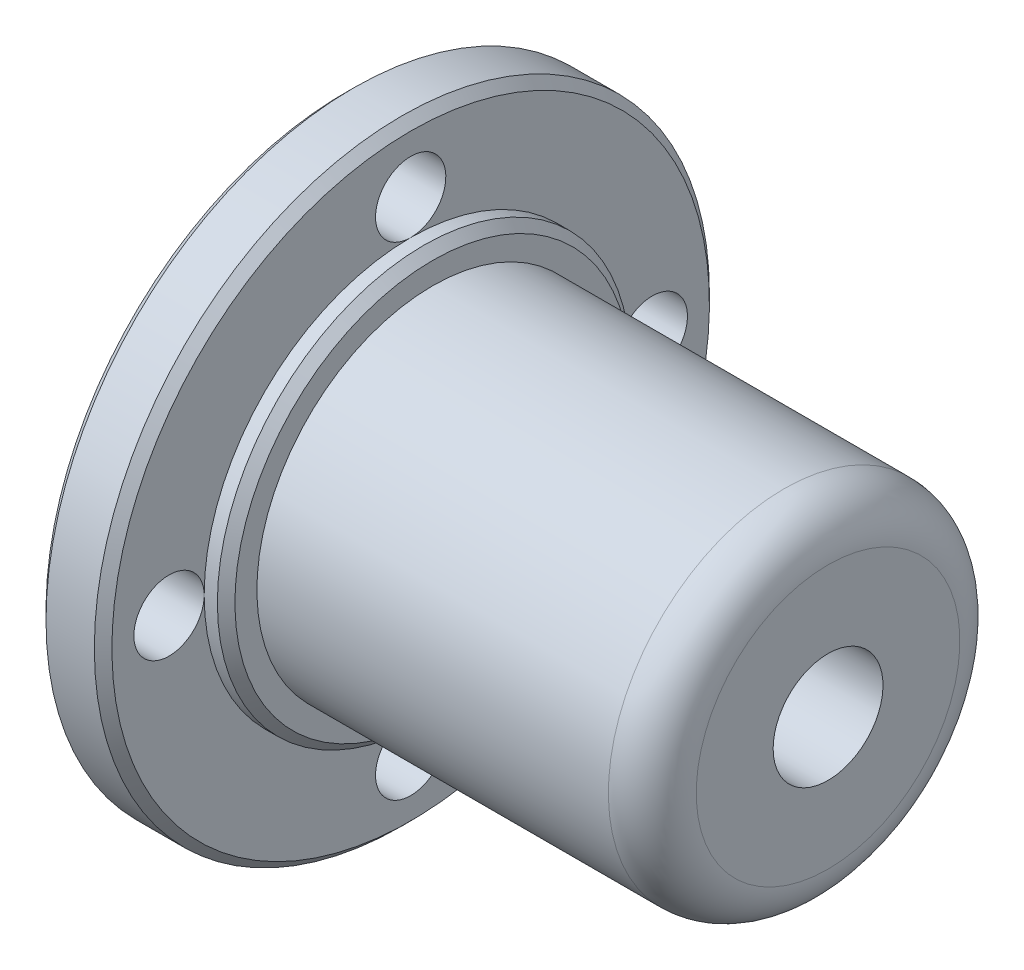
ISO-10303-21;
HEADER;
FILE_DESCRIPTION(('STEP AP214'),'2;1');
FILE_NAME('part.step','',(''),(''),'','','');
FILE_SCHEMA(('AUTOMOTIVE_DESIGN { 1 0 10303 214 1 1 1 1 }'));
ENDSEC;
DATA;
#1=APPLICATION_CONTEXT('core data for automotive mechanical design processes');
#2=APPLICATION_PROTOCOL_DEFINITION('international standard','automotive_design',2000,#1);
#3=PRODUCT_CONTEXT('',#1,'mechanical');
#4=PRODUCT('Part','Part','',(#3));
#5=PRODUCT_RELATED_PRODUCT_CATEGORY('part','',(#4));
#6=PRODUCT_DEFINITION_FORMATION('','',#4);
#7=PRODUCT_DEFINITION_CONTEXT('part definition',#1,'design');
#8=PRODUCT_DEFINITION('design','',#6,#7);
#9=PRODUCT_DEFINITION_SHAPE('','',#8);
#10=(LENGTH_UNIT() NAMED_UNIT(*) SI_UNIT(.MILLI.,.METRE.));
#11=(NAMED_UNIT(*) PLANE_ANGLE_UNIT() SI_UNIT($,.RADIAN.));
#12=(NAMED_UNIT(*) SI_UNIT($,.STERADIAN.) SOLID_ANGLE_UNIT());
#13=UNCERTAINTY_MEASURE_WITH_UNIT(LENGTH_MEASURE(1.E-05),#10,'distance_accuracy_value','');
#14=(GEOMETRIC_REPRESENTATION_CONTEXT(3) GLOBAL_UNCERTAINTY_ASSIGNED_CONTEXT((#13)) GLOBAL_UNIT_ASSIGNED_CONTEXT((#10,
#11,#12)) REPRESENTATION_CONTEXT('',''));
#15=CARTESIAN_POINT('',(0.,0.,0.));
#16=DIRECTION('',(0.,0.,1.));
#17=DIRECTION('',(1.,0.,0.));
#18=AXIS2_PLACEMENT_3D('',#15,#16,#17);
#19=CARTESIAN_POINT('',(11.,4.,0.));
#20=DIRECTION('',(1.,0.,0.));
#21=DIRECTION('',(0.,1.,0.));
#22=AXIS2_PLACEMENT_3D('',#19,#20,#21);
#23=PLANE('',#22);
#24=CARTESIAN_POINT('',(11.,0.,0.));
#25=DIRECTION('',(1.,0.,0.));
#26=DIRECTION('',(0.,1.,0.));
#27=AXIS2_PLACEMENT_3D('',#24,#25,#26);
#28=CIRCLE('',#27,3.);
#29=CARTESIAN_POINT('',(11.,3.,0.));
#30=VERTEX_POINT('',#29);
#31=EDGE_CURVE('E107',#30,#30,#28,.T.);
#32=ORIENTED_EDGE('',*,*,#31,.T.);
#33=EDGE_LOOP('',(#32));
#34=FACE_BOUND('',#33,.T.);
#35=CARTESIAN_POINT('',(11.,0.,0.));
#36=DIRECTION('',(1.,0.,0.));
#37=DIRECTION('',(0.,1.,0.));
#38=AXIS2_PLACEMENT_3D('',#35,#36,#37);
#39=CIRCLE('',#38,1.25);
#40=CARTESIAN_POINT('',(11.,1.25,0.));
#41=VERTEX_POINT('',#40);
#42=EDGE_CURVE('E90',#41,#41,#39,.T.);
#43=ORIENTED_EDGE('',*,*,#42,.F.);
#44=EDGE_LOOP('',(#43));
#45=FACE_BOUND('',#44,.T.);
#46=ADVANCED_FACE('F42',(#34,#45),#23,.T.);
#47=CARTESIAN_POINT('',(6.,0.,0.));
#48=DIRECTION('',(-1.,0.,0.));
#49=DIRECTION('',(0.,-1.,0.));
#50=AXIS2_PLACEMENT_3D('',#47,#48,#49);
#51=PLANE('',#50);
#52=CARTESIAN_POINT('',(6.,0.,0.));
#53=DIRECTION('',(-1.,0.,0.));
#54=DIRECTION('',(0.,0.,1.));
#55=AXIS2_PLACEMENT_3D('',#52,#53,#54);
#56=CIRCLE('',#55,1.25);
#57=CARTESIAN_POINT('',(6.,0.,1.25));
#58=VERTEX_POINT('',#57);
#59=EDGE_CURVE('E86',#58,#58,#56,.T.);
#60=ORIENTED_EDGE('',*,*,#59,.F.);
#61=EDGE_LOOP('',(#60));
#62=FACE_BOUND('',#61,.T.);
#63=CARTESIAN_POINT('',(6.,0.,0.));
#64=DIRECTION('',(1.,0.,0.));
#65=DIRECTION('',(0.,1.,0.));
#66=AXIS2_PLACEMENT_3D('',#63,#64,#65);
#67=CIRCLE('',#66,2.5);
#68=CARTESIAN_POINT('',(6.,2.5,0.));
#69=VERTEX_POINT('',#68);
#70=EDGE_CURVE('E104',#69,#69,#67,.T.);
#71=ORIENTED_EDGE('',*,*,#70,.F.);
#72=EDGE_LOOP('',(#71));
#73=FACE_BOUND('',#72,.T.);
#74=ADVANCED_FACE('F153',(#62,#73),#51,.T.);
#75=CARTESIAN_POINT('',(11.,0.,0.));
#76=DIRECTION('',(1.,0.,0.));
#77=DIRECTION('',(0.,1.,0.));
#78=AXIS2_PLACEMENT_3D('',#75,#76,#77);
#79=CYLINDRICAL_SURFACE('',#78,2.5);
#80=CARTESIAN_POINT('',(1.19999999999999,0.,0.));
#81=DIRECTION('',(-1.,0.,0.));
#82=DIRECTION('',(0.,-1.,0.));
#83=AXIS2_PLACEMENT_3D('',#80,#81,#82);
#84=CIRCLE('',#83,2.5);
#85=CARTESIAN_POINT('',(1.19999999999999,-2.5,0.));
#86=VERTEX_POINT('',#85);
#87=EDGE_CURVE('E131',#86,#86,#84,.T.);
#88=ORIENTED_EDGE('',*,*,#87,.T.);
#89=EDGE_LOOP('',(#88));
#90=FACE_BOUND('',#89,.T.);
#91=ORIENTED_EDGE('',*,*,#70,.T.);
#92=EDGE_LOOP('',(#91));
#93=FACE_BOUND('',#92,.T.);
#94=ADVANCED_FACE('F159',(#90,#93),#79,.F.);
#95=CARTESIAN_POINT('',(1.,2.5,0.));
#96=DIRECTION('',(-1.,0.,0.));
#97=DIRECTION('',(0.,-1.,0.));
#98=AXIS2_PLACEMENT_3D('',#95,#96,#97);
#99=PLANE('',#98);
#100=CARTESIAN_POINT('',(1.,0.,0.));
#101=DIRECTION('',(-1.,0.,0.));
#102=DIRECTION('',(0.,-1.,0.));
#103=AXIS2_PLACEMENT_3D('',#100,#101,#102);
#104=CIRCLE('',#103,2.69999999999999);
#105=CARTESIAN_POINT('',(1.,-2.7,0.));
#106=VERTEX_POINT('',#105);
#107=EDGE_CURVE('E128',#106,#106,#104,.F.);
#108=ORIENTED_EDGE('',*,*,#107,.T.);
#109=EDGE_LOOP('',(#108));
#110=FACE_BOUND('',#109,.T.);
#111=CARTESIAN_POINT('',(0.999999999999999,0.,0.));
#112=DIRECTION('',(1.,0.,0.));
#113=DIRECTION('',(0.,1.,0.));
#114=AXIS2_PLACEMENT_3D('',#111,#112,#113);
#115=CIRCLE('',#114,4.);
#116=CARTESIAN_POINT('',(0.999999999999999,4.,0.));
#117=VERTEX_POINT('',#116);
#118=EDGE_CURVE('E101',#117,#117,#115,.T.);
#119=ORIENTED_EDGE('',*,*,#118,.F.);
#120=EDGE_LOOP('',(#119));
#121=FACE_BOUND('',#120,.T.);
#122=ADVANCED_FACE('F219',(#110,#121),#99,.T.);
#123=CARTESIAN_POINT('',(11.,0.,0.));
#124=DIRECTION('',(1.,0.,0.));
#125=DIRECTION('',(0.,1.,0.));
#126=AXIS2_PLACEMENT_3D('',#123,#124,#125);
#127=CYLINDRICAL_SURFACE('',#126,4.);
#128=CARTESIAN_POINT('',(0.200000000000001,0.,0.));
#129=DIRECTION('',(-1.,0.,0.));
#130=DIRECTION('',(0.,-1.,0.));
#131=AXIS2_PLACEMENT_3D('',#128,#129,#130);
#132=CIRCLE('',#131,4.);
#133=CARTESIAN_POINT('',(0.200000000000001,-4.,0.));
#134=VERTEX_POINT('',#133);
#135=EDGE_CURVE('E134',#134,#134,#132,.T.);
#136=ORIENTED_EDGE('',*,*,#135,.T.);
#137=EDGE_LOOP('',(#136));
#138=FACE_BOUND('',#137,.T.);
#139=ORIENTED_EDGE('',*,*,#118,.T.);
#140=EDGE_LOOP('',(#139));
#141=FACE_BOUND('',#140,.T.);
#142=ADVANCED_FACE('F209',(#138,#141),#127,.F.);
#143=CARTESIAN_POINT('',(0.,4.,0.));
#144=DIRECTION('',(-1.,0.,0.));
#145=DIRECTION('',(0.,-1.,0.));
#146=AXIS2_PLACEMENT_3D('',#143,#144,#145);
#147=PLANE('',#146);
#148=CARTESIAN_POINT('',(0.,0.,-5.5));
#149=DIRECTION('',(-1.,0.,0.));
#150=DIRECTION('',(0.,0.,1.));
#151=AXIS2_PLACEMENT_3D('',#148,#149,#150);
#152=CIRCLE('',#151,0.799999999999999);
#153=CARTESIAN_POINT('',(0.,0.,-4.7));
#154=VERTEX_POINT('',#153);
#155=EDGE_CURVE('E446',#154,#154,#152,.T.);
#156=ORIENTED_EDGE('',*,*,#155,.F.);
#157=EDGE_LOOP('',(#156));
#158=FACE_BOUND('',#157,.T.);
#159=CARTESIAN_POINT('',(0.,5.5,0.));
#160=DIRECTION('',(-1.,0.,0.));
#161=DIRECTION('',(0.,0.,1.));
#162=AXIS2_PLACEMENT_3D('',#159,#160,#161);
#163=CIRCLE('',#162,0.799999999999999);
#164=CARTESIAN_POINT('',(0.,5.5,0.799999999999999));
#165=VERTEX_POINT('',#164);
#166=EDGE_CURVE('E436',#165,#165,#163,.T.);
#167=ORIENTED_EDGE('',*,*,#166,.F.);
#168=EDGE_LOOP('',(#167));
#169=FACE_BOUND('',#168,.T.);
#170=CARTESIAN_POINT('',(0.,0.,5.5));
#171=DIRECTION('',(-1.,0.,0.));
#172=DIRECTION('',(0.,0.,1.));
#173=AXIS2_PLACEMENT_3D('',#170,#171,#172);
#174=CIRCLE('',#173,0.799999999999999);
#175=CARTESIAN_POINT('',(0.,0.,6.3));
#176=VERTEX_POINT('',#175);
#177=EDGE_CURVE('E439',#176,#176,#174,.T.);
#178=ORIENTED_EDGE('',*,*,#177,.F.);
#179=EDGE_LOOP('',(#178));
#180=FACE_BOUND('',#179,.T.);
#181=CARTESIAN_POINT('',(0.,-5.5,0.));
#182=DIRECTION('',(-1.,0.,0.));
#183=DIRECTION('',(0.,0.,1.));
#184=AXIS2_PLACEMENT_3D('',#181,#182,#183);
#185=CIRCLE('',#184,0.799999999999999);
#186=CARTESIAN_POINT('',(0.,-5.5,0.8));
#187=VERTEX_POINT('',#186);
#188=EDGE_CURVE('E87',#187,#187,#185,.T.);
#189=ORIENTED_EDGE('',*,*,#188,.F.);
#190=EDGE_LOOP('',(#189));
#191=FACE_BOUND('',#190,.T.);
#192=CARTESIAN_POINT('',(0.,0.,0.));
#193=DIRECTION('',(-1.,0.,0.));
#194=DIRECTION('',(0.,-1.,0.));
#195=AXIS2_PLACEMENT_3D('',#192,#193,#194);
#196=CIRCLE('',#195,6.8);
#197=CARTESIAN_POINT('',(0.,-6.8,0.));
#198=VERTEX_POINT('',#197);
#199=EDGE_CURVE('E125',#198,#198,#196,.T.);
#200=ORIENTED_EDGE('',*,*,#199,.T.);
#201=EDGE_LOOP('',(#200));
#202=FACE_BOUND('',#201,.T.);
#203=CARTESIAN_POINT('',(0.,0.,0.));
#204=DIRECTION('',(-1.,0.,0.));
#205=DIRECTION('',(0.,-1.,0.));
#206=AXIS2_PLACEMENT_3D('',#203,#204,#205);
#207=CIRCLE('',#206,4.2);
#208=CARTESIAN_POINT('',(0.,-4.2,0.));
#209=VERTEX_POINT('',#208);
#210=EDGE_CURVE('E122',#209,#209,#207,.F.);
#211=ORIENTED_EDGE('',*,*,#210,.T.);
#212=EDGE_LOOP('',(#211));
#213=FACE_BOUND('',#212,.T.);
#214=ADVANCED_FACE('F206',(#158,#169,#180,#191,#202,#213),#147,.T.);
#215=CARTESIAN_POINT('',(11.,0.,0.));
#216=DIRECTION('',(1.,0.,0.));
#217=DIRECTION('',(0.,1.,0.));
#218=AXIS2_PLACEMENT_3D('',#215,#216,#217);
#219=CYLINDRICAL_SURFACE('',#218,7.);
#220=CARTESIAN_POINT('',(1.29999999999999,0.,0.));
#221=DIRECTION('',(1.,0.,0.));
#222=DIRECTION('',(0.,1.,0.));
#223=AXIS2_PLACEMENT_3D('',#220,#221,#222);
#224=CIRCLE('',#223,7.);
#225=CARTESIAN_POINT('',(1.29999999999999,7.,0.));
#226=VERTEX_POINT('',#225);
#227=EDGE_CURVE('E119',#226,#226,#224,.F.);
#228=ORIENTED_EDGE('',*,*,#227,.T.);
#229=EDGE_LOOP('',(#228));
#230=FACE_BOUND('',#229,.T.);
#231=CARTESIAN_POINT('',(0.200000000000001,0.,0.));
#232=DIRECTION('',(-1.,0.,0.));
#233=DIRECTION('',(0.,-1.,0.));
#234=AXIS2_PLACEMENT_3D('',#231,#232,#233);
#235=CIRCLE('',#234,7.);
#236=CARTESIAN_POINT('',(0.200000000000001,-7.,0.));
#237=VERTEX_POINT('',#236);
#238=EDGE_CURVE('E116',#237,#237,#235,.F.);
#239=ORIENTED_EDGE('',*,*,#238,.T.);
#240=EDGE_LOOP('',(#239));
#241=FACE_BOUND('',#240,.T.);
#242=ADVANCED_FACE('F208',(#230,#241),#219,.T.);
#243=CARTESIAN_POINT('',(1.5,4.7,0.));
#244=DIRECTION('',(1.,0.,0.));
#245=DIRECTION('',(0.,1.,0.));
#246=AXIS2_PLACEMENT_3D('',#243,#244,#245);
#247=PLANE('',#246);
#248=CARTESIAN_POINT('',(1.5,0.,0.));
#249=DIRECTION('',(1.,0.,0.));
#250=DIRECTION('',(0.,1.,0.));
#251=AXIS2_PLACEMENT_3D('',#248,#249,#250);
#252=CIRCLE('',#251,6.8);
#253=CARTESIAN_POINT('',(1.5,6.8,0.));
#254=VERTEX_POINT('',#253);
#255=EDGE_CURVE('E113',#254,#254,#252,.T.);
#256=ORIENTED_EDGE('',*,*,#255,.T.);
#257=EDGE_LOOP('',(#256));
#258=FACE_BOUND('',#257,.T.);
#259=CARTESIAN_POINT('',(1.5,0.,0.));
#260=DIRECTION('',(1.,0.,0.));
#261=DIRECTION('',(0.,1.,0.));
#262=AXIS2_PLACEMENT_3D('',#259,#260,#261);
#263=CIRCLE('',#262,4.7);
#264=CARTESIAN_POINT('',(1.5,0.,-4.7));
#265=VERTEX_POINT('',#264);
#266=CARTESIAN_POINT('',(1.5,4.7,0.));
#267=VERTEX_POINT('',#266);
#268=EDGE_CURVE('E63',#265,#267,#263,.T.);
#269=ORIENTED_EDGE('',*,*,#268,.F.);
#270=CARTESIAN_POINT('',(1.5,0.,-5.5));
#271=DIRECTION('',(1.,0.,0.));
#272=DIRECTION('',(0.,1.,0.));
#273=AXIS2_PLACEMENT_3D('',#270,#271,#272);
#274=CIRCLE('',#273,0.799999999999999);
#275=EDGE_CURVE('E56',#265,#265,#274,.T.);
#276=ORIENTED_EDGE('',*,*,#275,.F.);
#277=CARTESIAN_POINT('',(1.5,-4.7,0.));
#278=VERTEX_POINT('',#277);
#279=EDGE_CURVE('E74',#278,#265,#263,.T.);
#280=ORIENTED_EDGE('',*,*,#279,.F.);
#281=CARTESIAN_POINT('',(1.5,-5.5,0.));
#282=DIRECTION('',(1.,0.,0.));
#283=DIRECTION('',(0.,1.,0.));
#284=AXIS2_PLACEMENT_3D('',#281,#282,#283);
#285=CIRCLE('',#284,0.799999999999999);
#286=EDGE_CURVE('E84',#278,#278,#285,.T.);
#287=ORIENTED_EDGE('',*,*,#286,.F.);
#288=CARTESIAN_POINT('',(1.5,0.,4.7));
#289=VERTEX_POINT('',#288);
#290=EDGE_CURVE('E70',#289,#278,#263,.T.);
#291=ORIENTED_EDGE('',*,*,#290,.F.);
#292=CARTESIAN_POINT('',(1.5,0.,5.5));
#293=DIRECTION('',(1.,0.,0.));
#294=DIRECTION('',(0.,1.,0.));
#295=AXIS2_PLACEMENT_3D('',#292,#293,#294);
#296=CIRCLE('',#295,0.799999999999999);
#297=EDGE_CURVE('E93',#289,#289,#296,.T.);
#298=ORIENTED_EDGE('',*,*,#297,.F.);
#299=EDGE_CURVE('E76',#267,#289,#263,.T.);
#300=ORIENTED_EDGE('',*,*,#299,.F.);
#301=CARTESIAN_POINT('',(1.5,5.5,0.));
#302=DIRECTION('',(1.,0.,0.));
#303=DIRECTION('',(0.,1.,0.));
#304=AXIS2_PLACEMENT_3D('',#301,#302,#303);
#305=CIRCLE('',#304,0.799999999999999);
#306=EDGE_CURVE('E438',#267,#267,#305,.T.);
#307=ORIENTED_EDGE('',*,*,#306,.F.);
#308=EDGE_LOOP('',(#269,#276,#280,#287,#291,#298,#300,#307));
#309=FACE_BOUND('',#308,.T.);
#310=ADVANCED_FACE('F216',(#258,#309),#247,.T.);
#311=CARTESIAN_POINT('',(11.,0.,0.));
#312=DIRECTION('',(1.,0.,0.));
#313=DIRECTION('',(0.,1.,0.));
#314=AXIS2_PLACEMENT_3D('',#311,#312,#313);
#315=CYLINDRICAL_SURFACE('',#314,4.7);
#316=CARTESIAN_POINT('',(1.8,0.,0.));
#317=DIRECTION('',(1.,0.,0.));
#318=DIRECTION('',(0.,1.,0.));
#319=AXIS2_PLACEMENT_3D('',#316,#317,#318);
#320=CIRCLE('',#319,4.7);
#321=CARTESIAN_POINT('',(1.8,4.7,0.));
#322=VERTEX_POINT('',#321);
#323=EDGE_CURVE('E11',#322,#322,#320,.F.);
#324=ORIENTED_EDGE('',*,*,#323,.T.);
#325=EDGE_LOOP('',(#324));
#326=FACE_BOUND('',#325,.T.);
#327=ORIENTED_EDGE('',*,*,#279,.T.);
#328=ORIENTED_EDGE('',*,*,#268,.T.);
#329=ORIENTED_EDGE('',*,*,#299,.T.);
#330=ORIENTED_EDGE('',*,*,#290,.T.);
#331=EDGE_LOOP('',(#327,#328,#329,#330));
#332=FACE_BOUND('',#331,.T.);
#333=ADVANCED_FACE('F72',(#326,#332),#315,.T.);
#334=CARTESIAN_POINT('',(2.,4.7,0.));
#335=DIRECTION('',(1.,0.,0.));
#336=DIRECTION('',(0.,1.,0.));
#337=AXIS2_PLACEMENT_3D('',#334,#335,#336);
#338=PLANE('',#337);
#339=CARTESIAN_POINT('',(2.,0.,0.));
#340=DIRECTION('',(1.,0.,0.));
#341=DIRECTION('',(0.,1.,0.));
#342=AXIS2_PLACEMENT_3D('',#339,#340,#341);
#343=CIRCLE('',#342,4.5);
#344=CARTESIAN_POINT('',(2.,4.5,0.));
#345=VERTEX_POINT('',#344);
#346=EDGE_CURVE('E51',#345,#345,#343,.T.);
#347=ORIENTED_EDGE('',*,*,#346,.T.);
#348=EDGE_LOOP('',(#347));
#349=FACE_BOUND('',#348,.T.);
#350=CARTESIAN_POINT('',(2.,0.,0.));
#351=DIRECTION('',(1.,0.,0.));
#352=DIRECTION('',(0.,1.,0.));
#353=AXIS2_PLACEMENT_3D('',#350,#351,#352);
#354=CIRCLE('',#353,4.);
#355=CARTESIAN_POINT('',(2.,4.,0.));
#356=VERTEX_POINT('',#355);
#357=EDGE_CURVE('E81',#356,#356,#354,.T.);
#358=ORIENTED_EDGE('',*,*,#357,.F.);
#359=EDGE_LOOP('',(#358));
#360=FACE_BOUND('',#359,.T.);
#361=ADVANCED_FACE('F139',(#349,#360),#338,.T.);
#362=CARTESIAN_POINT('',(11.,0.,0.));
#363=DIRECTION('',(1.,0.,0.));
#364=DIRECTION('',(0.,1.,0.));
#365=AXIS2_PLACEMENT_3D('',#362,#363,#364);
#366=CYLINDRICAL_SURFACE('',#365,4.);
#367=CARTESIAN_POINT('',(10.,0.,0.));
#368=DIRECTION('',(1.,0.,0.));
#369=DIRECTION('',(0.,1.,0.));
#370=AXIS2_PLACEMENT_3D('',#367,#368,#369);
#371=CIRCLE('',#370,4.);
#372=CARTESIAN_POINT('',(10.,4.,0.));
#373=VERTEX_POINT('',#372);
#374=EDGE_CURVE('E110',#373,#373,#371,.F.);
#375=ORIENTED_EDGE('',*,*,#374,.T.);
#376=EDGE_LOOP('',(#375));
#377=FACE_BOUND('',#376,.T.);
#378=ORIENTED_EDGE('',*,*,#357,.T.);
#379=EDGE_LOOP('',(#378));
#380=FACE_BOUND('',#379,.T.);
#381=ADVANCED_FACE('F355',(#377,#380),#366,.T.);
#382=CARTESIAN_POINT('',(6.,0.,0.));
#383=DIRECTION('',(-1.,0.,0.));
#384=DIRECTION('',(0.,0.,1.));
#385=AXIS2_PLACEMENT_3D('',#382,#383,#384);
#386=CYLINDRICAL_SURFACE('',#385,1.25);
#387=ORIENTED_EDGE('',*,*,#59,.T.);
#388=EDGE_LOOP('',(#387));
#389=FACE_BOUND('',#388,.T.);
#390=ORIENTED_EDGE('',*,*,#42,.T.);
#391=EDGE_LOOP('',(#390));
#392=FACE_BOUND('',#391,.T.);
#393=ADVANCED_FACE('F169',(#389,#392),#386,.F.);
#394=CARTESIAN_POINT('',(10.,0.,0.));
#395=DIRECTION('',(1.,0.,0.));
#396=DIRECTION('',(0.,1.,0.));
#397=AXIS2_PLACEMENT_3D('',#394,#395,#396);
#398=TOROIDAL_SURFACE('',#397,3.,1.);
#399=ORIENTED_EDGE('',*,*,#374,.F.);
#400=EDGE_LOOP('',(#399));
#401=FACE_BOUND('',#400,.T.);
#402=ORIENTED_EDGE('',*,*,#31,.F.);
#403=EDGE_LOOP('',(#402));
#404=FACE_BOUND('',#403,.T.);
#405=ADVANCED_FACE('F165',(#401,#404),#398,.T.);
#406=CARTESIAN_POINT('',(1.5,0.,0.));
#407=DIRECTION('',(-1.,0.,0.));
#408=DIRECTION('',(0.,-1.,0.));
#409=AXIS2_PLACEMENT_3D('',#406,#407,#408);
#410=CONICAL_SURFACE('',#409,6.8,0.785398163397444);
#411=ORIENTED_EDGE('',*,*,#227,.F.);
#412=EDGE_LOOP('',(#411));
#413=FACE_BOUND('',#412,.T.);
#414=ORIENTED_EDGE('',*,*,#255,.F.);
#415=EDGE_LOOP('',(#414));
#416=FACE_BOUND('',#415,.T.);
#417=ADVANCED_FACE('F168',(#413,#416),#410,.T.);
#418=CARTESIAN_POINT('',(0.200000000000002,0.,0.));
#419=DIRECTION('',(1.,0.,0.));
#420=DIRECTION('',(0.,1.,0.));
#421=AXIS2_PLACEMENT_3D('',#418,#419,#420);
#422=CONICAL_SURFACE('',#421,7.,0.785398163397453);
#423=ORIENTED_EDGE('',*,*,#199,.F.);
#424=EDGE_LOOP('',(#423));
#425=FACE_BOUND('',#424,.T.);
#426=ORIENTED_EDGE('',*,*,#238,.F.);
#427=EDGE_LOOP('',(#426));
#428=FACE_BOUND('',#427,.T.);
#429=ADVANCED_FACE('F177',(#425,#428),#422,.T.);
#430=CARTESIAN_POINT('',(0.999999999999999,0.,0.));
#431=DIRECTION('',(-1.,0.,0.));
#432=DIRECTION('',(0.,-1.,0.));
#433=AXIS2_PLACEMENT_3D('',#430,#431,#432);
#434=CONICAL_SURFACE('',#433,2.7,0.785398163397445);
#435=ORIENTED_EDGE('',*,*,#87,.F.);
#436=EDGE_LOOP('',(#435));
#437=FACE_BOUND('',#436,.T.);
#438=ORIENTED_EDGE('',*,*,#107,.F.);
#439=EDGE_LOOP('',(#438));
#440=FACE_BOUND('',#439,.T.);
#441=ADVANCED_FACE('F184',(#437,#440),#434,.F.);
#442=CARTESIAN_POINT('',(0.,0.,0.));
#443=DIRECTION('',(-1.,0.,0.));
#444=DIRECTION('',(0.,-1.,0.));
#445=AXIS2_PLACEMENT_3D('',#442,#443,#444);
#446=CONICAL_SURFACE('',#445,4.2,0.785398163397442);
#447=ORIENTED_EDGE('',*,*,#135,.F.);
#448=EDGE_LOOP('',(#447));
#449=FACE_BOUND('',#448,.T.);
#450=ORIENTED_EDGE('',*,*,#210,.F.);
#451=EDGE_LOOP('',(#450));
#452=FACE_BOUND('',#451,.T.);
#453=ADVANCED_FACE('F190',(#449,#452),#446,.F.);
#454=CARTESIAN_POINT('',(0.,-5.5,0.));
#455=DIRECTION('',(-1.,0.,0.));
#456=DIRECTION('',(0.,0.,1.));
#457=AXIS2_PLACEMENT_3D('',#454,#455,#456);
#458=CYLINDRICAL_SURFACE('',#457,0.799999999999999);
#459=ORIENTED_EDGE('',*,*,#188,.T.);
#460=EDGE_LOOP('',(#459));
#461=FACE_BOUND('',#460,.T.);
#462=ORIENTED_EDGE('',*,*,#286,.T.);
#463=EDGE_LOOP('',(#462));
#464=FACE_BOUND('',#463,.T.);
#465=ADVANCED_FACE('F85',(#461,#464),#458,.F.);
#466=CARTESIAN_POINT('',(0.,0.,5.5));
#467=DIRECTION('',(-1.,0.,0.));
#468=DIRECTION('',(0.,0.,1.));
#469=AXIS2_PLACEMENT_3D('',#466,#467,#468);
#470=CYLINDRICAL_SURFACE('',#469,0.799999999999999);
#471=ORIENTED_EDGE('',*,*,#177,.T.);
#472=EDGE_LOOP('',(#471));
#473=FACE_BOUND('',#472,.T.);
#474=ORIENTED_EDGE('',*,*,#297,.T.);
#475=EDGE_LOOP('',(#474));
#476=FACE_BOUND('',#475,.T.);
#477=ADVANCED_FACE('F199',(#473,#476),#470,.F.);
#478=CARTESIAN_POINT('',(0.,5.5,0.));
#479=DIRECTION('',(-1.,0.,0.));
#480=DIRECTION('',(0.,0.,1.));
#481=AXIS2_PLACEMENT_3D('',#478,#479,#480);
#482=CYLINDRICAL_SURFACE('',#481,0.799999999999999);
#483=ORIENTED_EDGE('',*,*,#166,.T.);
#484=EDGE_LOOP('',(#483));
#485=FACE_BOUND('',#484,.T.);
#486=ORIENTED_EDGE('',*,*,#306,.T.);
#487=EDGE_LOOP('',(#486));
#488=FACE_BOUND('',#487,.T.);
#489=ADVANCED_FACE('F148',(#485,#488),#482,.F.);
#490=CARTESIAN_POINT('',(0.,0.,-5.5));
#491=DIRECTION('',(-1.,0.,0.));
#492=DIRECTION('',(0.,0.,1.));
#493=AXIS2_PLACEMENT_3D('',#490,#491,#492);
#494=CYLINDRICAL_SURFACE('',#493,0.799999999999999);
#495=ORIENTED_EDGE('',*,*,#155,.T.);
#496=EDGE_LOOP('',(#495));
#497=FACE_BOUND('',#496,.T.);
#498=ORIENTED_EDGE('',*,*,#275,.T.);
#499=EDGE_LOOP('',(#498));
#500=FACE_BOUND('',#499,.T.);
#501=ADVANCED_FACE('F143',(#497,#500),#494,.F.);
#502=CARTESIAN_POINT('',(2.,0.,0.));
#503=DIRECTION('',(-1.,0.,0.));
#504=DIRECTION('',(0.,-1.,0.));
#505=AXIS2_PLACEMENT_3D('',#502,#503,#504);
#506=CONICAL_SURFACE('',#505,4.5,0.785398163397446);
#507=ORIENTED_EDGE('',*,*,#323,.F.);
#508=EDGE_LOOP('',(#507));
#509=FACE_BOUND('',#508,.T.);
#510=ORIENTED_EDGE('',*,*,#346,.F.);
#511=EDGE_LOOP('',(#510));
#512=FACE_BOUND('',#511,.T.);
#513=ADVANCED_FACE('F45',(#509,#512),#506,.T.);
#514=CLOSED_SHELL('',(#46,#74,#94,#122,#142,#214,#242,#310,#333,#361,#381,#393,#405,#417,#429,
#441,#453,#465,#477,#489,#501,#513));
#515=MANIFOLD_SOLID_BREP('B2',#514);
#516=ADVANCED_BREP_SHAPE_REPRESENTATION('',(#18,#515),#14);
#517=SHAPE_DEFINITION_REPRESENTATION(#9,#516);
ENDSEC;
END-ISO-10303-21;
